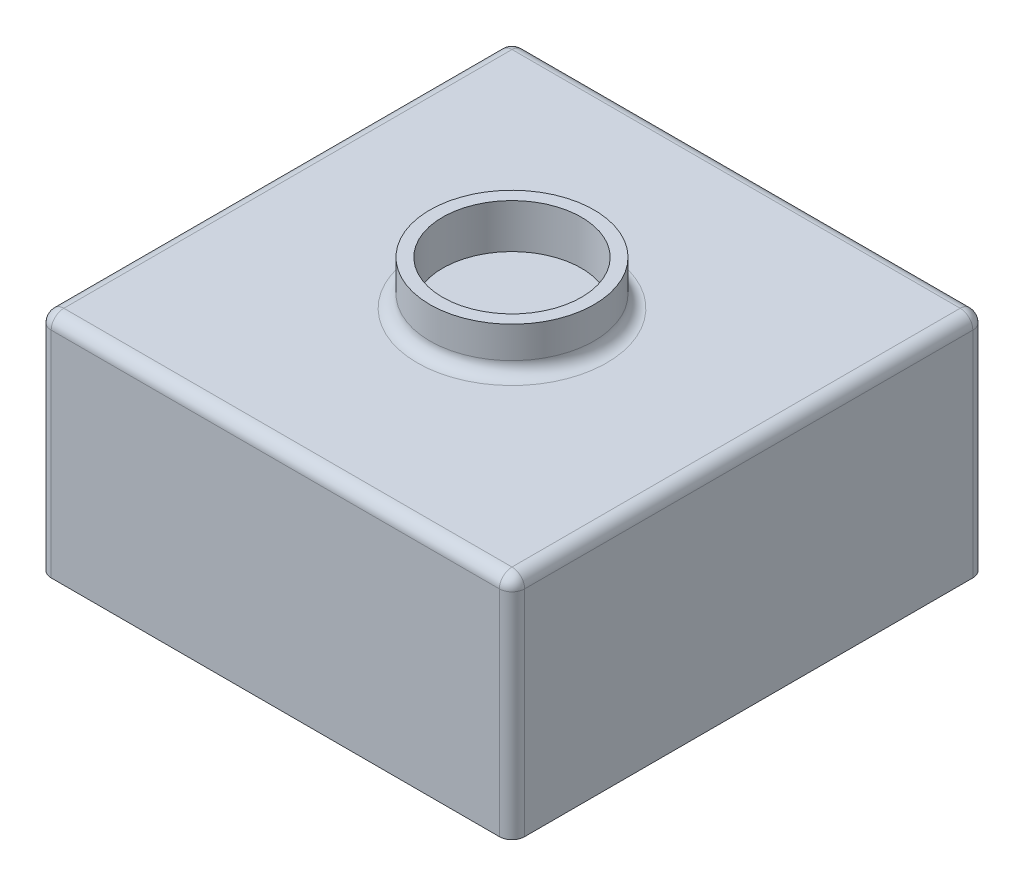
ISO-10303-21;
HEADER;
FILE_DESCRIPTION(('STEP AP214'),'2;1');
FILE_NAME('part.step','',(''),(''),'','','');
FILE_SCHEMA(('AUTOMOTIVE_DESIGN { 1 0 10303 214 1 1 1 1 }'));
ENDSEC;
DATA;
#1=APPLICATION_CONTEXT('core data for automotive mechanical design processes');
#2=APPLICATION_PROTOCOL_DEFINITION('international standard','automotive_design',2000,#1);
#3=PRODUCT_CONTEXT('',#1,'mechanical');
#4=PRODUCT('Part','Part','',(#3));
#5=PRODUCT_RELATED_PRODUCT_CATEGORY('part','',(#4));
#6=PRODUCT_DEFINITION_FORMATION('','',#4);
#7=PRODUCT_DEFINITION_CONTEXT('part definition',#1,'design');
#8=PRODUCT_DEFINITION('design','',#6,#7);
#9=PRODUCT_DEFINITION_SHAPE('','',#8);
#10=(LENGTH_UNIT() NAMED_UNIT(*) SI_UNIT(.MILLI.,.METRE.));
#11=(NAMED_UNIT(*) PLANE_ANGLE_UNIT() SI_UNIT($,.RADIAN.));
#12=(NAMED_UNIT(*) SI_UNIT($,.STERADIAN.) SOLID_ANGLE_UNIT());
#13=UNCERTAINTY_MEASURE_WITH_UNIT(LENGTH_MEASURE(1.E-05),#10,'distance_accuracy_value','');
#14=(GEOMETRIC_REPRESENTATION_CONTEXT(3) GLOBAL_UNCERTAINTY_ASSIGNED_CONTEXT((#13)) GLOBAL_UNIT_ASSIGNED_CONTEXT((#10,
#11,#12)) REPRESENTATION_CONTEXT('',''));
#15=CARTESIAN_POINT('',(0.,0.,0.));
#16=DIRECTION('',(0.,0.,1.));
#17=DIRECTION('',(1.,0.,0.));
#18=AXIS2_PLACEMENT_3D('',#15,#16,#17);
#19=CARTESIAN_POINT('',(-187.5,180.,187.5));
#20=DIRECTION('',(1.,0.,0.));
#21=DIRECTION('',(0.,0.,-1.));
#22=AXIS2_PLACEMENT_3D('',#19,#20,#21);
#23=PLANE('',#22);
#24=DIRECTION('',(0.,0.,1.));
#25=VECTOR('',#24,1.);
#26=CARTESIAN_POINT('',(-187.5,170.,-187.5));
#27=LINE('',#26,#25);
#28=CARTESIAN_POINT('',(-187.5,170.,177.5));
#29=VERTEX_POINT('',#28);
#30=CARTESIAN_POINT('',(-187.5,170.,-177.5));
#31=VERTEX_POINT('',#30);
#32=EDGE_CURVE('E53',#29,#31,#27,.F.);
#33=ORIENTED_EDGE('',*,*,#32,.T.);
#34=DIRECTION('',(0.,-1.,0.));
#35=VECTOR('',#34,1.);
#36=CARTESIAN_POINT('',(-187.5,180.,-177.5));
#37=LINE('',#36,#35);
#38=CARTESIAN_POINT('',(-187.5,0.,-177.5));
#39=VERTEX_POINT('',#38);
#40=EDGE_CURVE('E11',#31,#39,#37,.T.);
#41=ORIENTED_EDGE('',*,*,#40,.T.);
#42=DIRECTION('',(0.,0.,1.));
#43=VECTOR('',#42,1.);
#44=CARTESIAN_POINT('',(-187.5,0.,187.5));
#45=LINE('',#44,#43);
#46=CARTESIAN_POINT('',(-187.5,0.,177.5));
#47=VERTEX_POINT('',#46);
#48=EDGE_CURVE('E157',#39,#47,#45,.T.);
#49=ORIENTED_EDGE('',*,*,#48,.T.);
#50=DIRECTION('',(0.,-1.,0.));
#51=VECTOR('',#50,1.);
#52=CARTESIAN_POINT('',(-187.5,180.,177.5));
#53=LINE('',#52,#51);
#54=EDGE_CURVE('E64',#47,#29,#53,.F.);
#55=ORIENTED_EDGE('',*,*,#54,.T.);
#56=EDGE_LOOP('',(#33,#41,#49,#55));
#57=FACE_BOUND('',#56,.T.);
#58=ADVANCED_FACE('F43',(#57),#23,.F.);
#59=CARTESIAN_POINT('',(187.5,180.,187.5));
#60=DIRECTION('',(0.,0.,-1.));
#61=DIRECTION('',(-1.,0.,0.));
#62=AXIS2_PLACEMENT_3D('',#59,#60,#61);
#63=PLANE('',#62);
#64=DIRECTION('',(1.,0.,0.));
#65=VECTOR('',#64,1.);
#66=CARTESIAN_POINT('',(187.5,0.,187.5));
#67=LINE('',#66,#65);
#68=CARTESIAN_POINT('',(-177.5,0.,187.5));
#69=VERTEX_POINT('',#68);
#70=CARTESIAN_POINT('',(177.5,0.,187.5));
#71=VERTEX_POINT('',#70);
#72=EDGE_CURVE('E150',#69,#71,#67,.T.);
#73=ORIENTED_EDGE('',*,*,#72,.T.);
#74=DIRECTION('',(0.,-1.,0.));
#75=VECTOR('',#74,1.);
#76=CARTESIAN_POINT('',(177.5,180.,187.5));
#77=LINE('',#76,#75);
#78=CARTESIAN_POINT('',(177.5,170.,187.5));
#79=VERTEX_POINT('',#78);
#80=EDGE_CURVE('E125',#71,#79,#77,.F.);
#81=ORIENTED_EDGE('',*,*,#80,.T.);
#82=DIRECTION('',(1.,0.,0.));
#83=VECTOR('',#82,1.);
#84=CARTESIAN_POINT('',(-187.5,170.,187.5));
#85=LINE('',#84,#83);
#86=CARTESIAN_POINT('',(-177.5,170.,187.5));
#87=VERTEX_POINT('',#86);
#88=EDGE_CURVE('E182',#79,#87,#85,.F.);
#89=ORIENTED_EDGE('',*,*,#88,.T.);
#90=DIRECTION('',(0.,-1.,0.));
#91=VECTOR('',#90,1.);
#92=CARTESIAN_POINT('',(-177.5,180.,187.5));
#93=LINE('',#92,#91);
#94=EDGE_CURVE('E131',#87,#69,#93,.T.);
#95=ORIENTED_EDGE('',*,*,#94,.T.);
#96=EDGE_LOOP('',(#73,#81,#89,#95));
#97=FACE_BOUND('',#96,.T.);
#98=ADVANCED_FACE('F308',(#97),#63,.F.);
#99=CARTESIAN_POINT('',(187.5,180.,187.5));
#100=DIRECTION('',(-1.,0.,0.));
#101=DIRECTION('',(0.,0.,1.));
#102=AXIS2_PLACEMENT_3D('',#99,#100,#101);
#103=PLANE('',#102);
#104=DIRECTION('',(0.,0.,-1.));
#105=VECTOR('',#104,1.);
#106=CARTESIAN_POINT('',(187.5,170.,187.5));
#107=LINE('',#106,#105);
#108=CARTESIAN_POINT('',(187.5,170.,-177.5));
#109=VERTEX_POINT('',#108);
#110=CARTESIAN_POINT('',(187.5,170.,177.5));
#111=VERTEX_POINT('',#110);
#112=EDGE_CURVE('E140',#109,#111,#107,.F.);
#113=ORIENTED_EDGE('',*,*,#112,.T.);
#114=DIRECTION('',(0.,-1.,0.));
#115=VECTOR('',#114,1.);
#116=CARTESIAN_POINT('',(187.5,180.,177.5));
#117=LINE('',#116,#115);
#118=CARTESIAN_POINT('',(187.5,0.,177.5));
#119=VERTEX_POINT('',#118);
#120=EDGE_CURVE('E124',#111,#119,#117,.T.);
#121=ORIENTED_EDGE('',*,*,#120,.T.);
#122=DIRECTION('',(0.,0.,-1.));
#123=VECTOR('',#122,1.);
#124=CARTESIAN_POINT('',(187.5,0.,187.5));
#125=LINE('',#124,#123);
#126=CARTESIAN_POINT('',(187.5,0.,-177.5));
#127=VERTEX_POINT('',#126);
#128=EDGE_CURVE('E137',#119,#127,#125,.T.);
#129=ORIENTED_EDGE('',*,*,#128,.T.);
#130=DIRECTION('',(0.,-1.,0.));
#131=VECTOR('',#130,1.);
#132=CARTESIAN_POINT('',(187.5,180.,-177.5));
#133=LINE('',#132,#131);
#134=EDGE_CURVE('E168',#127,#109,#133,.F.);
#135=ORIENTED_EDGE('',*,*,#134,.T.);
#136=EDGE_LOOP('',(#113,#121,#129,#135));
#137=FACE_BOUND('',#136,.T.);
#138=ADVANCED_FACE('F136',(#137),#103,.F.);
#139=CARTESIAN_POINT('',(187.5,180.,-187.5));
#140=DIRECTION('',(0.,0.,1.));
#141=DIRECTION('',(1.,0.,0.));
#142=AXIS2_PLACEMENT_3D('',#139,#140,#141);
#143=PLANE('',#142);
#144=DIRECTION('',(-1.,0.,0.));
#145=VECTOR('',#144,1.);
#146=CARTESIAN_POINT('',(187.5,170.,-187.5));
#147=LINE('',#146,#145);
#148=CARTESIAN_POINT('',(-177.5,170.,-187.5));
#149=VERTEX_POINT('',#148);
#150=CARTESIAN_POINT('',(177.5,170.,-187.5));
#151=VERTEX_POINT('',#150);
#152=EDGE_CURVE('E203',#149,#151,#147,.F.);
#153=ORIENTED_EDGE('',*,*,#152,.T.);
#154=DIRECTION('',(0.,-1.,0.));
#155=VECTOR('',#154,1.);
#156=CARTESIAN_POINT('',(177.5,180.,-187.5));
#157=LINE('',#156,#155);
#158=CARTESIAN_POINT('',(177.5,0.,-187.5));
#159=VERTEX_POINT('',#158);
#160=EDGE_CURVE('E206',#151,#159,#157,.T.);
#161=ORIENTED_EDGE('',*,*,#160,.T.);
#162=DIRECTION('',(-1.,0.,0.));
#163=VECTOR('',#162,1.);
#164=CARTESIAN_POINT('',(187.5,0.,-187.5));
#165=LINE('',#164,#163);
#166=CARTESIAN_POINT('',(-177.5,0.,-187.5));
#167=VERTEX_POINT('',#166);
#168=EDGE_CURVE('E149',#159,#167,#165,.T.);
#169=ORIENTED_EDGE('',*,*,#168,.T.);
#170=DIRECTION('',(0.,-1.,0.));
#171=VECTOR('',#170,1.);
#172=CARTESIAN_POINT('',(-177.5,180.,-187.5));
#173=LINE('',#172,#171);
#174=EDGE_CURVE('E200',#167,#149,#173,.F.);
#175=ORIENTED_EDGE('',*,*,#174,.T.);
#176=EDGE_LOOP('',(#153,#161,#169,#175));
#177=FACE_BOUND('',#176,.T.);
#178=ADVANCED_FACE('F507',(#177),#143,.F.);
#179=CARTESIAN_POINT('',(0.,180.,0.));
#180=DIRECTION('',(0.,1.,0.));
#181=DIRECTION('',(0.,0.,1.));
#182=AXIS2_PLACEMENT_3D('',#179,#180,#181);
#183=PLANE('',#182);
#184=DIRECTION('',(1.,0.,0.));
#185=VECTOR('',#184,1.);
#186=CARTESIAN_POINT('',(187.5,180.,177.5));
#187=LINE('',#186,#185);
#188=CARTESIAN_POINT('',(-177.5,180.,177.5));
#189=VERTEX_POINT('',#188);
#190=CARTESIAN_POINT('',(177.5,180.,177.5));
#191=VERTEX_POINT('',#190);
#192=EDGE_CURVE('E187',#189,#191,#187,.T.);
#193=ORIENTED_EDGE('',*,*,#192,.T.);
#194=DIRECTION('',(0.,0.,-1.));
#195=VECTOR('',#194,1.);
#196=CARTESIAN_POINT('',(177.5,180.,-187.5));
#197=LINE('',#196,#195);
#198=CARTESIAN_POINT('',(177.5,180.,-177.5));
#199=VERTEX_POINT('',#198);
#200=EDGE_CURVE('E196',#191,#199,#197,.T.);
#201=ORIENTED_EDGE('',*,*,#200,.T.);
#202=DIRECTION('',(-1.,0.,0.));
#203=VECTOR('',#202,1.);
#204=CARTESIAN_POINT('',(-187.5,180.,-177.5));
#205=LINE('',#204,#203);
#206=CARTESIAN_POINT('',(-177.5,180.,-177.5));
#207=VERTEX_POINT('',#206);
#208=EDGE_CURVE('E193',#199,#207,#205,.T.);
#209=ORIENTED_EDGE('',*,*,#208,.T.);
#210=DIRECTION('',(0.,0.,1.));
#211=VECTOR('',#210,1.);
#212=CARTESIAN_POINT('',(-177.5,180.,187.5));
#213=LINE('',#212,#211);
#214=EDGE_CURVE('E190',#207,#189,#213,.T.);
#215=ORIENTED_EDGE('',*,*,#214,.T.);
#216=EDGE_LOOP('',(#193,#201,#209,#215));
#217=FACE_BOUND('',#216,.T.);
#218=CARTESIAN_POINT('',(0.,180.,0.));
#219=DIRECTION('',(0.,1.,0.));
#220=DIRECTION('',(0.,0.,1.));
#221=AXIS2_PLACEMENT_3D('',#218,#219,#220);
#222=CIRCLE('',#221,75.);
#223=CARTESIAN_POINT('',(0.,180.,75.));
#224=VERTEX_POINT('',#223);
#225=EDGE_CURVE('E164',#224,#224,#222,.F.);
#226=ORIENTED_EDGE('',*,*,#225,.T.);
#227=EDGE_LOOP('',(#226));
#228=FACE_BOUND('',#227,.T.);
#229=ADVANCED_FACE('F290',(#217,#228),#183,.T.);
#230=CARTESIAN_POINT('',(0.,0.,0.));
#231=DIRECTION('',(0.,1.,0.));
#232=DIRECTION('',(0.,0.,1.));
#233=AXIS2_PLACEMENT_3D('',#230,#231,#232);
#234=PLANE('',#233);
#235=ORIENTED_EDGE('',*,*,#128,.F.);
#236=CARTESIAN_POINT('',(177.5,0.,177.5));
#237=DIRECTION('',(0.,1.,0.));
#238=DIRECTION('',(0.,0.,1.));
#239=AXIS2_PLACEMENT_3D('',#236,#237,#238);
#240=CIRCLE('',#239,10.);
#241=EDGE_CURVE('E120',#119,#71,#240,.F.);
#242=ORIENTED_EDGE('',*,*,#241,.T.);
#243=ORIENTED_EDGE('',*,*,#72,.F.);
#244=CARTESIAN_POINT('',(-177.5,0.,177.5));
#245=DIRECTION('',(0.,1.,0.));
#246=DIRECTION('',(0.,0.,1.));
#247=AXIS2_PLACEMENT_3D('',#244,#245,#246);
#248=CIRCLE('',#247,10.);
#249=EDGE_CURVE('E143',#69,#47,#248,.F.);
#250=ORIENTED_EDGE('',*,*,#249,.T.);
#251=ORIENTED_EDGE('',*,*,#48,.F.);
#252=CARTESIAN_POINT('',(-177.5,0.,-177.5));
#253=DIRECTION('',(0.,1.,0.));
#254=DIRECTION('',(0.,0.,1.));
#255=AXIS2_PLACEMENT_3D('',#252,#253,#254);
#256=CIRCLE('',#255,10.);
#257=EDGE_CURVE('E175',#39,#167,#256,.F.);
#258=ORIENTED_EDGE('',*,*,#257,.T.);
#259=ORIENTED_EDGE('',*,*,#168,.F.);
#260=CARTESIAN_POINT('',(177.5,0.,-177.5));
#261=DIRECTION('',(0.,1.,0.));
#262=DIRECTION('',(0.,0.,1.));
#263=AXIS2_PLACEMENT_3D('',#260,#261,#262);
#264=CIRCLE('',#263,10.);
#265=EDGE_CURVE('E132',#159,#127,#264,.F.);
#266=ORIENTED_EDGE('',*,*,#265,.T.);
#267=EDGE_LOOP('',(#235,#242,#243,#250,#251,#258,#259,#266));
#268=FACE_BOUND('',#267,.T.);
#269=ADVANCED_FACE('F145',(#268),#234,.F.);
#270=CARTESIAN_POINT('',(0.,215.,0.));
#271=DIRECTION('',(0.,-1.,0.));
#272=DIRECTION('',(0.,0.,-1.));
#273=AXIS2_PLACEMENT_3D('',#270,#271,#272);
#274=CYLINDRICAL_SURFACE('',#273,65.);
#275=CARTESIAN_POINT('',(0.,190.,0.));
#276=DIRECTION('',(0.,1.,0.));
#277=DIRECTION('',(0.,0.,1.));
#278=AXIS2_PLACEMENT_3D('',#275,#276,#277);
#279=CIRCLE('',#278,65.);
#280=CARTESIAN_POINT('',(0.,190.,65.));
#281=VERTEX_POINT('',#280);
#282=EDGE_CURVE('E155',#281,#281,#279,.T.);
#283=ORIENTED_EDGE('',*,*,#282,.T.);
#284=EDGE_LOOP('',(#283));
#285=FACE_BOUND('',#284,.T.);
#286=CARTESIAN_POINT('',(0.,215.,0.));
#287=DIRECTION('',(0.,1.,0.));
#288=DIRECTION('',(0.,0.,1.));
#289=AXIS2_PLACEMENT_3D('',#286,#287,#288);
#290=CIRCLE('',#289,65.);
#291=CARTESIAN_POINT('',(0.,215.,65.));
#292=VERTEX_POINT('',#291);
#293=EDGE_CURVE('E270',#292,#292,#290,.T.);
#294=ORIENTED_EDGE('',*,*,#293,.F.);
#295=EDGE_LOOP('',(#294));
#296=FACE_BOUND('',#295,.T.);
#297=ADVANCED_FACE('F479',(#285,#296),#274,.T.);
#298=CARTESIAN_POINT('',(0.,215.,0.));
#299=DIRECTION('',(0.,1.,0.));
#300=DIRECTION('',(0.,0.,1.));
#301=AXIS2_PLACEMENT_3D('',#298,#299,#300);
#302=PLANE('',#301);
#303=CARTESIAN_POINT('',(0.,215.,0.));
#304=DIRECTION('',(0.,1.,0.));
#305=DIRECTION('',(0.,0.,1.));
#306=AXIS2_PLACEMENT_3D('',#303,#304,#305);
#307=CIRCLE('',#306,55.);
#308=CARTESIAN_POINT('',(0.,215.,55.));
#309=VERTEX_POINT('',#308);
#310=EDGE_CURVE('E258',#309,#309,#307,.T.);
#311=ORIENTED_EDGE('',*,*,#310,.F.);
#312=EDGE_LOOP('',(#311));
#313=FACE_BOUND('',#312,.T.);
#314=ORIENTED_EDGE('',*,*,#293,.T.);
#315=EDGE_LOOP('',(#314));
#316=FACE_BOUND('',#315,.T.);
#317=ADVANCED_FACE('F468',(#313,#316),#302,.T.);
#318=CARTESIAN_POINT('',(0.,24.4365081389595,0.));
#319=DIRECTION('',(0.,1.,0.));
#320=DIRECTION('',(0.,0.,1.));
#321=AXIS2_PLACEMENT_3D('',#318,#319,#320);
#322=CYLINDRICAL_SURFACE('',#321,55.);
#323=CARTESIAN_POINT('',(0.,180.,0.));
#324=DIRECTION('',(0.,1.,0.));
#325=DIRECTION('',(0.,0.,1.));
#326=AXIS2_PLACEMENT_3D('',#323,#324,#325);
#327=CIRCLE('',#326,55.);
#328=CARTESIAN_POINT('',(0.,180.,55.));
#329=VERTEX_POINT('',#328);
#330=EDGE_CURVE('E264',#329,#329,#327,.F.);
#331=ORIENTED_EDGE('',*,*,#330,.T.);
#332=EDGE_LOOP('',(#331));
#333=FACE_BOUND('',#332,.T.);
#334=ORIENTED_EDGE('',*,*,#310,.T.);
#335=EDGE_LOOP('',(#334));
#336=FACE_BOUND('',#335,.T.);
#337=ADVANCED_FACE('F457',(#333,#336),#322,.F.);
#338=CARTESIAN_POINT('',(0.,180.,0.));
#339=DIRECTION('',(0.,1.,0.));
#340=DIRECTION('',(0.,0.,1.));
#341=AXIS2_PLACEMENT_3D('',#338,#339,#340);
#342=PLANE('',#341);
#343=ORIENTED_EDGE('',*,*,#330,.F.);
#344=EDGE_LOOP('',(#343));
#345=FACE_BOUND('',#344,.T.);
#346=ADVANCED_FACE('F319',(#345),#342,.T.);
#347=CARTESIAN_POINT('',(0.,190.,0.));
#348=DIRECTION('',(0.,1.,0.));
#349=DIRECTION('',(0.,0.,1.));
#350=AXIS2_PLACEMENT_3D('',#347,#348,#349);
#351=TOROIDAL_SURFACE('',#350,75.,10.);
#352=ORIENTED_EDGE('',*,*,#225,.F.);
#353=EDGE_LOOP('',(#352));
#354=FACE_BOUND('',#353,.T.);
#355=ORIENTED_EDGE('',*,*,#282,.F.);
#356=EDGE_LOOP('',(#355));
#357=FACE_BOUND('',#356,.T.);
#358=ADVANCED_FACE('F305',(#354,#357),#351,.F.);
#359=CARTESIAN_POINT('',(-177.5,180.,-177.5));
#360=DIRECTION('',(0.,-1.,0.));
#361=DIRECTION('',(0.,0.,-1.));
#362=AXIS2_PLACEMENT_3D('',#359,#360,#361);
#363=CYLINDRICAL_SURFACE('',#362,10.);
#364=CARTESIAN_POINT('',(-177.5,170.,-177.5));
#365=DIRECTION('',(0.,1.,0.));
#366=DIRECTION('',(0.,0.,1.));
#367=AXIS2_PLACEMENT_3D('',#364,#365,#366);
#368=CIRCLE('',#367,10.);
#369=EDGE_CURVE('E47',#149,#31,#368,.T.);
#370=ORIENTED_EDGE('',*,*,#369,.F.);
#371=ORIENTED_EDGE('',*,*,#174,.F.);
#372=ORIENTED_EDGE('',*,*,#257,.F.);
#373=ORIENTED_EDGE('',*,*,#40,.F.);
#374=EDGE_LOOP('',(#370,#371,#372,#373));
#375=FACE_BOUND('',#374,.T.);
#376=ADVANCED_FACE('F45',(#375),#363,.T.);
#377=CARTESIAN_POINT('',(-177.5,170.,-177.5));
#378=DIRECTION('',(-1.,0.,0.));
#379=DIRECTION('',(0.,0.,1.));
#380=AXIS2_PLACEMENT_3D('',#377,#378,#379);
#381=SPHERICAL_SURFACE('',#380,10.);
#382=CARTESIAN_POINT('',(-177.5,170.,-177.5));
#383=DIRECTION('',(-1.,0.,0.));
#384=DIRECTION('',(0.,0.,1.));
#385=AXIS2_PLACEMENT_3D('',#382,#383,#384);
#386=CIRCLE('',#385,10.);
#387=EDGE_CURVE('E247',#149,#207,#386,.F.);
#388=ORIENTED_EDGE('',*,*,#387,.F.);
#389=ORIENTED_EDGE('',*,*,#369,.T.);
#390=CARTESIAN_POINT('',(-177.5,170.,-177.5));
#391=DIRECTION('',(0.,0.,-1.));
#392=DIRECTION('',(0.,1.,0.));
#393=AXIS2_PLACEMENT_3D('',#390,#391,#392);
#394=CIRCLE('',#393,10.);
#395=EDGE_CURVE('E250',#207,#31,#394,.F.);
#396=ORIENTED_EDGE('',*,*,#395,.F.);
#397=EDGE_LOOP('',(#388,#389,#396));
#398=FACE_BOUND('',#397,.T.);
#399=ADVANCED_FACE('F298',(#398),#381,.T.);
#400=CARTESIAN_POINT('',(-177.5,180.,177.5));
#401=DIRECTION('',(0.,-1.,0.));
#402=DIRECTION('',(0.,0.,-1.));
#403=AXIS2_PLACEMENT_3D('',#400,#401,#402);
#404=CYLINDRICAL_SURFACE('',#403,10.);
#405=ORIENTED_EDGE('',*,*,#249,.F.);
#406=ORIENTED_EDGE('',*,*,#94,.F.);
#407=CARTESIAN_POINT('',(-177.5,170.,177.5));
#408=DIRECTION('',(0.,1.,0.));
#409=DIRECTION('',(0.,0.,1.));
#410=AXIS2_PLACEMENT_3D('',#407,#408,#409);
#411=CIRCLE('',#410,10.);
#412=EDGE_CURVE('E243',#29,#87,#411,.T.);
#413=ORIENTED_EDGE('',*,*,#412,.F.);
#414=ORIENTED_EDGE('',*,*,#54,.F.);
#415=EDGE_LOOP('',(#405,#406,#413,#414));
#416=FACE_BOUND('',#415,.T.);
#417=ADVANCED_FACE('F281',(#416),#404,.T.);
#418=CARTESIAN_POINT('',(-177.5,170.,0.));
#419=DIRECTION('',(0.,0.,-1.));
#420=DIRECTION('',(-1.,0.,0.));
#421=AXIS2_PLACEMENT_3D('',#418,#419,#420);
#422=CYLINDRICAL_SURFACE('',#421,10.);
#423=ORIENTED_EDGE('',*,*,#395,.T.);
#424=ORIENTED_EDGE('',*,*,#32,.F.);
#425=CARTESIAN_POINT('',(-177.5,170.,177.5));
#426=DIRECTION('',(0.,0.,1.));
#427=DIRECTION('',(1.,0.,0.));
#428=AXIS2_PLACEMENT_3D('',#425,#426,#427);
#429=CIRCLE('',#428,10.);
#430=EDGE_CURVE('E239',#189,#29,#429,.T.);
#431=ORIENTED_EDGE('',*,*,#430,.F.);
#432=ORIENTED_EDGE('',*,*,#214,.F.);
#433=EDGE_LOOP('',(#423,#424,#431,#432));
#434=FACE_BOUND('',#433,.T.);
#435=ADVANCED_FACE('F288',(#434),#422,.T.);
#436=CARTESIAN_POINT('',(0.,170.,-177.5));
#437=DIRECTION('',(1.,0.,0.));
#438=DIRECTION('',(0.,0.,-1.));
#439=AXIS2_PLACEMENT_3D('',#436,#437,#438);
#440=CYLINDRICAL_SURFACE('',#439,10.);
#441=ORIENTED_EDGE('',*,*,#387,.T.);
#442=ORIENTED_EDGE('',*,*,#208,.F.);
#443=CARTESIAN_POINT('',(177.5,170.,-177.5));
#444=DIRECTION('',(1.,0.,0.));
#445=DIRECTION('',(0.,0.,-1.));
#446=AXIS2_PLACEMENT_3D('',#443,#444,#445);
#447=CIRCLE('',#446,10.);
#448=EDGE_CURVE('E235',#151,#199,#447,.T.);
#449=ORIENTED_EDGE('',*,*,#448,.F.);
#450=ORIENTED_EDGE('',*,*,#152,.F.);
#451=EDGE_LOOP('',(#441,#442,#449,#450));
#452=FACE_BOUND('',#451,.T.);
#453=ADVANCED_FACE('F297',(#452),#440,.T.);
#454=CARTESIAN_POINT('',(177.5,180.,-177.5));
#455=DIRECTION('',(0.,-1.,0.));
#456=DIRECTION('',(0.,0.,-1.));
#457=AXIS2_PLACEMENT_3D('',#454,#455,#456);
#458=CYLINDRICAL_SURFACE('',#457,10.);
#459=ORIENTED_EDGE('',*,*,#265,.F.);
#460=ORIENTED_EDGE('',*,*,#160,.F.);
#461=CARTESIAN_POINT('',(177.5,170.,-177.5));
#462=DIRECTION('',(0.,1.,0.));
#463=DIRECTION('',(0.,0.,1.));
#464=AXIS2_PLACEMENT_3D('',#461,#462,#463);
#465=CIRCLE('',#464,10.);
#466=EDGE_CURVE('E231',#109,#151,#465,.T.);
#467=ORIENTED_EDGE('',*,*,#466,.F.);
#468=ORIENTED_EDGE('',*,*,#134,.F.);
#469=EDGE_LOOP('',(#459,#460,#467,#468));
#470=FACE_BOUND('',#469,.T.);
#471=ADVANCED_FACE('F341',(#470),#458,.T.);
#472=CARTESIAN_POINT('',(-177.5,170.,177.5));
#473=DIRECTION('',(-1.,0.,0.));
#474=DIRECTION('',(0.,0.,1.));
#475=AXIS2_PLACEMENT_3D('',#472,#473,#474);
#476=SPHERICAL_SURFACE('',#475,10.);
#477=ORIENTED_EDGE('',*,*,#430,.T.);
#478=ORIENTED_EDGE('',*,*,#412,.T.);
#479=CARTESIAN_POINT('',(-177.5,170.,177.5));
#480=DIRECTION('',(-1.,0.,0.));
#481=DIRECTION('',(0.,-1.,0.));
#482=AXIS2_PLACEMENT_3D('',#479,#480,#481);
#483=CIRCLE('',#482,10.);
#484=EDGE_CURVE('E227',#189,#87,#483,.F.);
#485=ORIENTED_EDGE('',*,*,#484,.F.);
#486=EDGE_LOOP('',(#477,#478,#485));
#487=FACE_BOUND('',#486,.T.);
#488=ADVANCED_FACE('F286',(#487),#476,.T.);
#489=CARTESIAN_POINT('',(177.5,170.,-177.5));
#490=DIRECTION('',(0.,0.,-1.));
#491=DIRECTION('',(-1.,0.,0.));
#492=AXIS2_PLACEMENT_3D('',#489,#490,#491);
#493=SPHERICAL_SURFACE('',#492,10.);
#494=ORIENTED_EDGE('',*,*,#466,.T.);
#495=ORIENTED_EDGE('',*,*,#448,.T.);
#496=CARTESIAN_POINT('',(177.5,170.,-177.5));
#497=DIRECTION('',(0.,0.,-1.));
#498=DIRECTION('',(-1.,0.,0.));
#499=AXIS2_PLACEMENT_3D('',#496,#497,#498);
#500=CIRCLE('',#499,10.);
#501=EDGE_CURVE('E224',#109,#199,#500,.F.);
#502=ORIENTED_EDGE('',*,*,#501,.F.);
#503=EDGE_LOOP('',(#494,#495,#502));
#504=FACE_BOUND('',#503,.T.);
#505=ADVANCED_FACE('F334',(#504),#493,.T.);
#506=CARTESIAN_POINT('',(0.,170.,177.5));
#507=DIRECTION('',(-1.,0.,0.));
#508=DIRECTION('',(0.,0.,1.));
#509=AXIS2_PLACEMENT_3D('',#506,#507,#508);
#510=CYLINDRICAL_SURFACE('',#509,10.);
#511=ORIENTED_EDGE('',*,*,#484,.T.);
#512=ORIENTED_EDGE('',*,*,#88,.F.);
#513=CARTESIAN_POINT('',(177.5,170.,177.5));
#514=DIRECTION('',(1.,0.,0.));
#515=DIRECTION('',(0.,0.,-1.));
#516=AXIS2_PLACEMENT_3D('',#513,#514,#515);
#517=CIRCLE('',#516,10.);
#518=EDGE_CURVE('E220',#191,#79,#517,.T.);
#519=ORIENTED_EDGE('',*,*,#518,.F.);
#520=ORIENTED_EDGE('',*,*,#192,.F.);
#521=EDGE_LOOP('',(#511,#512,#519,#520));
#522=FACE_BOUND('',#521,.T.);
#523=ADVANCED_FACE('F330',(#522),#510,.T.);
#524=CARTESIAN_POINT('',(177.5,170.,0.));
#525=DIRECTION('',(0.,0.,1.));
#526=DIRECTION('',(1.,0.,0.));
#527=AXIS2_PLACEMENT_3D('',#524,#525,#526);
#528=CYLINDRICAL_SURFACE('',#527,10.);
#529=ORIENTED_EDGE('',*,*,#501,.T.);
#530=ORIENTED_EDGE('',*,*,#200,.F.);
#531=CARTESIAN_POINT('',(177.5,170.,177.5));
#532=DIRECTION('',(0.,0.,1.));
#533=DIRECTION('',(1.,0.,0.));
#534=AXIS2_PLACEMENT_3D('',#531,#532,#533);
#535=CIRCLE('',#534,10.);
#536=EDGE_CURVE('E216',#111,#191,#535,.T.);
#537=ORIENTED_EDGE('',*,*,#536,.F.);
#538=ORIENTED_EDGE('',*,*,#112,.F.);
#539=EDGE_LOOP('',(#529,#530,#537,#538));
#540=FACE_BOUND('',#539,.T.);
#541=ADVANCED_FACE('F326',(#540),#528,.T.);
#542=CARTESIAN_POINT('',(177.5,170.,177.5));
#543=DIRECTION('',(0.,1.,0.));
#544=DIRECTION('',(0.,0.,1.));
#545=AXIS2_PLACEMENT_3D('',#542,#543,#544);
#546=SPHERICAL_SURFACE('',#545,10.);
#547=ORIENTED_EDGE('',*,*,#536,.T.);
#548=ORIENTED_EDGE('',*,*,#518,.T.);
#549=CARTESIAN_POINT('',(177.5,170.,177.5));
#550=DIRECTION('',(0.,1.,0.));
#551=DIRECTION('',(0.,0.,1.));
#552=AXIS2_PLACEMENT_3D('',#549,#550,#551);
#553=CIRCLE('',#552,10.);
#554=EDGE_CURVE('E213',#111,#79,#553,.F.);
#555=ORIENTED_EDGE('',*,*,#554,.F.);
#556=EDGE_LOOP('',(#547,#548,#555));
#557=FACE_BOUND('',#556,.T.);
#558=ADVANCED_FACE('F323',(#557),#546,.T.);
#559=CARTESIAN_POINT('',(177.5,180.,177.5));
#560=DIRECTION('',(0.,-1.,0.));
#561=DIRECTION('',(0.,0.,-1.));
#562=AXIS2_PLACEMENT_3D('',#559,#560,#561);
#563=CYLINDRICAL_SURFACE('',#562,10.);
#564=ORIENTED_EDGE('',*,*,#554,.T.);
#565=ORIENTED_EDGE('',*,*,#80,.F.);
#566=ORIENTED_EDGE('',*,*,#241,.F.);
#567=ORIENTED_EDGE('',*,*,#120,.F.);
#568=EDGE_LOOP('',(#564,#565,#566,#567));
#569=FACE_BOUND('',#568,.T.);
#570=ADVANCED_FACE('F123',(#569),#563,.T.);
#571=CLOSED_SHELL('',(#58,#98,#138,#178,#229,#269,#297,#317,#337,#346,#358,#376,#399,#417,#435,
#453,#471,#488,#505,#523,#541,#558,#570));
#572=MANIFOLD_SOLID_BREP('B2',#571);
#573=ADVANCED_BREP_SHAPE_REPRESENTATION('',(#18,#572),#14);
#574=SHAPE_DEFINITION_REPRESENTATION(#9,#573);
ENDSEC;
END-ISO-10303-21;
